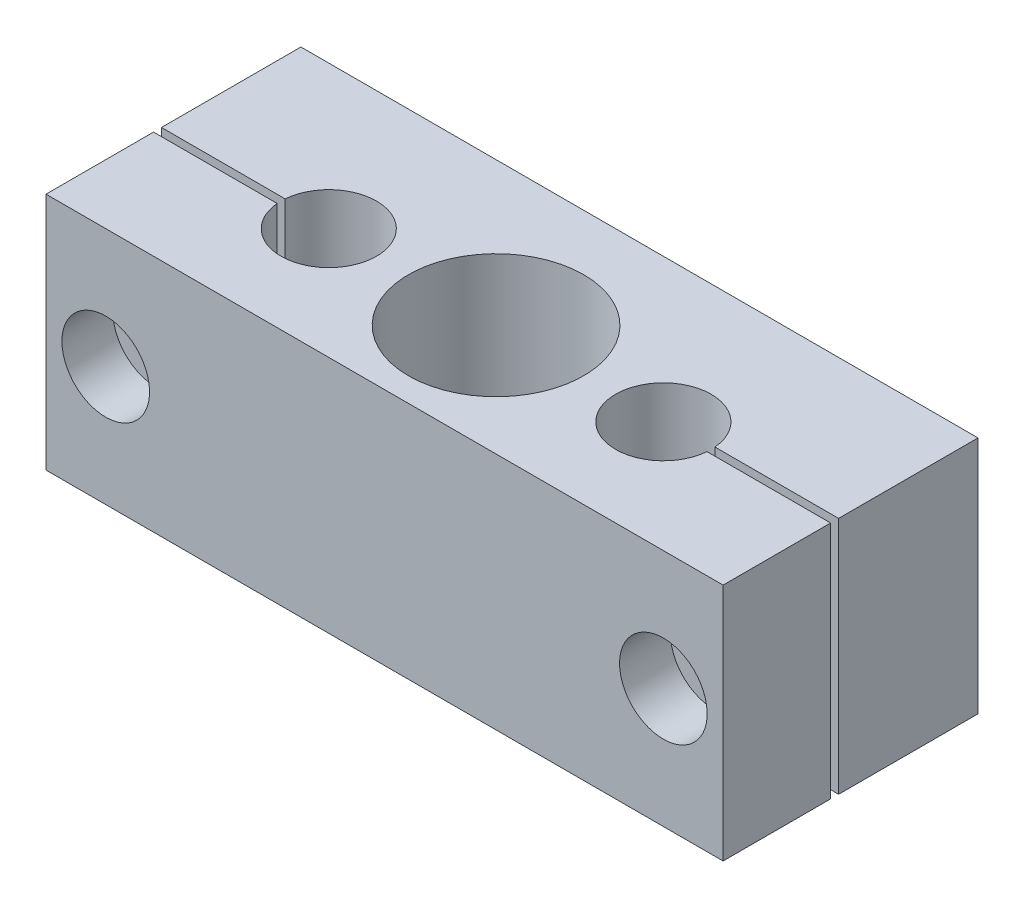
ISO-10303-21;
HEADER;
FILE_DESCRIPTION(('STEP AP214'),'2;1');
FILE_NAME('part.step','',(''),(''),'','','');
FILE_SCHEMA(('AUTOMOTIVE_DESIGN { 1 0 10303 214 1 1 1 1 }'));
ENDSEC;
DATA;
#1=APPLICATION_CONTEXT('core data for automotive mechanical design processes');
#2=APPLICATION_PROTOCOL_DEFINITION('international standard','automotive_design',2000,#1);
#3=PRODUCT_CONTEXT('',#1,'mechanical');
#4=PRODUCT('Part','Part','',(#3));
#5=PRODUCT_RELATED_PRODUCT_CATEGORY('part','',(#4));
#6=PRODUCT_DEFINITION_FORMATION('','',#4);
#7=PRODUCT_DEFINITION_CONTEXT('part definition',#1,'design');
#8=PRODUCT_DEFINITION('design','',#6,#7);
#9=PRODUCT_DEFINITION_SHAPE('','',#8);
#10=(LENGTH_UNIT() NAMED_UNIT(*) SI_UNIT(.MILLI.,.METRE.));
#11=(NAMED_UNIT(*) PLANE_ANGLE_UNIT() SI_UNIT($,.RADIAN.));
#12=(NAMED_UNIT(*) SI_UNIT($,.STERADIAN.) SOLID_ANGLE_UNIT());
#13=UNCERTAINTY_MEASURE_WITH_UNIT(LENGTH_MEASURE(1.E-05),#10,'distance_accuracy_value','');
#14=(GEOMETRIC_REPRESENTATION_CONTEXT(3) GLOBAL_UNCERTAINTY_ASSIGNED_CONTEXT((#13)) GLOBAL_UNIT_ASSIGNED_CONTEXT((#10,
#11,#12)) REPRESENTATION_CONTEXT('',''));
#15=CARTESIAN_POINT('',(0.,0.,0.));
#16=DIRECTION('',(0.,0.,1.));
#17=DIRECTION('',(1.,0.,0.));
#18=AXIS2_PLACEMENT_3D('',#15,#16,#17);
#19=CARTESIAN_POINT('',(-30.6,15.,25.6));
#20=DIRECTION('',(0.,0.,-1.));
#21=DIRECTION('',(-1.,0.,0.));
#22=AXIS2_PLACEMENT_3D('',#19,#20,#21);
#23=PLANE('',#22);
#24=CARTESIAN_POINT('',(-35.,15.,25.6));
#25=DIRECTION('',(0.,0.,-1.));
#26=DIRECTION('',(-1.,0.,0.));
#27=AXIS2_PLACEMENT_3D('',#24,#25,#26);
#28=CIRCLE('',#27,3.3);
#29=CARTESIAN_POINT('',(-38.3,15.,25.6));
#30=VERTEX_POINT('',#29);
#31=EDGE_CURVE('E23',#30,#30,#28,.T.);
#32=ORIENTED_EDGE('',*,*,#31,.T.);
#33=EDGE_LOOP('',(#32));
#34=FACE_BOUND('',#33,.T.);
#35=CARTESIAN_POINT('',(-35.,15.,25.6));
#36=DIRECTION('',(0.,0.,-1.));
#37=DIRECTION('',(-1.,0.,0.));
#38=AXIS2_PLACEMENT_3D('',#35,#36,#37);
#39=CIRCLE('',#38,5.5);
#40=CARTESIAN_POINT('',(-40.5,15.,25.6));
#41=VERTEX_POINT('',#40);
#42=EDGE_CURVE('E379',#41,#41,#39,.F.);
#43=ORIENTED_EDGE('',*,*,#42,.T.);
#44=EDGE_LOOP('',(#43));
#45=FACE_BOUND('',#44,.T.);
#46=ADVANCED_FACE('F19',(#34,#45),#23,.F.);
#47=CARTESIAN_POINT('',(39.4,15.,25.6));
#48=DIRECTION('',(0.,0.,-1.));
#49=DIRECTION('',(-1.,0.,0.));
#50=AXIS2_PLACEMENT_3D('',#47,#48,#49);
#51=PLANE('',#50);
#52=CARTESIAN_POINT('',(35.,15.,25.6));
#53=DIRECTION('',(0.,0.,-1.));
#54=DIRECTION('',(-1.,0.,0.));
#55=AXIS2_PLACEMENT_3D('',#52,#53,#54);
#56=CIRCLE('',#55,3.3);
#57=CARTESIAN_POINT('',(31.7,15.,25.6));
#58=VERTEX_POINT('',#57);
#59=EDGE_CURVE('E358',#58,#58,#56,.T.);
#60=ORIENTED_EDGE('',*,*,#59,.T.);
#61=EDGE_LOOP('',(#60));
#62=FACE_BOUND('',#61,.T.);
#63=CARTESIAN_POINT('',(35.,15.,25.6));
#64=DIRECTION('',(0.,0.,-1.));
#65=DIRECTION('',(-1.,0.,0.));
#66=AXIS2_PLACEMENT_3D('',#63,#64,#65);
#67=CIRCLE('',#66,5.5);
#68=CARTESIAN_POINT('',(29.5,15.,25.6));
#69=VERTEX_POINT('',#68);
#70=EDGE_CURVE('E879',#69,#69,#67,.F.);
#71=ORIENTED_EDGE('',*,*,#70,.T.);
#72=EDGE_LOOP('',(#71));
#73=FACE_BOUND('',#72,.T.);
#74=ADVANCED_FACE('F636',(#62,#73),#51,.F.);
#75=CARTESIAN_POINT('',(-35.,15.,17.5000000000409));
#76=DIRECTION('',(0.,0.,1.));
#77=DIRECTION('',(1.,0.,0.));
#78=AXIS2_PLACEMENT_3D('',#75,#76,#77);
#79=CONICAL_SURFACE('',#78,4.00000000004411,0.785398163397448);
#80=CARTESIAN_POINT('',(-35.,15.,16.9));
#81=DIRECTION('',(0.,0.,1.));
#82=DIRECTION('',(1.,0.,0.));
#83=AXIS2_PLACEMENT_3D('',#80,#81,#82);
#84=CIRCLE('',#83,3.4);
#85=CARTESIAN_POINT('',(-31.6,15.,16.9));
#86=VERTEX_POINT('',#85);
#87=EDGE_CURVE('E357',#86,#86,#84,.F.);
#88=ORIENTED_EDGE('',*,*,#87,.T.);
#89=EDGE_LOOP('',(#88));
#90=FACE_BOUND('',#89,.T.);
#91=CARTESIAN_POINT('',(-35.,15.,17.5000000000409));
#92=DIRECTION('',(0.,0.,1.));
#93=DIRECTION('',(1.,0.,0.));
#94=AXIS2_PLACEMENT_3D('',#91,#92,#93);
#95=CIRCLE('',#94,4.00000000004411);
#96=CARTESIAN_POINT('',(-30.9999999999559,15.,17.5000000000409));
#97=VERTEX_POINT('',#96);
#98=EDGE_CURVE('E361',#97,#97,#95,.F.);
#99=ORIENTED_EDGE('',*,*,#98,.F.);
#100=EDGE_LOOP('',(#99));
#101=FACE_BOUND('',#100,.T.);
#102=ADVANCED_FACE('F627',(#90,#101),#79,.F.);
#103=CARTESIAN_POINT('',(-35.,15.,21.55));
#104=DIRECTION('',(0.,0.,-1.));
#105=DIRECTION('',(-1.,0.,0.));
#106=AXIS2_PLACEMENT_3D('',#103,#104,#105);
#107=CYLINDRICAL_SURFACE('',#106,3.3);
#108=ORIENTED_EDGE('',*,*,#31,.F.);
#109=EDGE_LOOP('',(#108));
#110=FACE_BOUND('',#109,.T.);
#111=CARTESIAN_POINT('',(-35.,15.,18.5));
#112=DIRECTION('',(0.,0.,-1.));
#113=DIRECTION('',(-1.,0.,0.));
#114=AXIS2_PLACEMENT_3D('',#111,#112,#113);
#115=CIRCLE('',#114,3.3);
#116=CARTESIAN_POINT('',(-38.3,15.,18.5));
#117=VERTEX_POINT('',#116);
#118=EDGE_CURVE('E160',#117,#117,#115,.T.);
#119=ORIENTED_EDGE('',*,*,#118,.T.);
#120=EDGE_LOOP('',(#119));
#121=FACE_BOUND('',#120,.T.);
#122=ADVANCED_FACE('F619',(#110,#121),#107,.F.);
#123=CARTESIAN_POINT('',(35.,15.,28.8));
#124=DIRECTION('',(0.,0.,-1.));
#125=DIRECTION('',(-1.,0.,0.));
#126=AXIS2_PLACEMENT_3D('',#123,#124,#125);
#127=CYLINDRICAL_SURFACE('',#126,5.5);
#128=CARTESIAN_POINT('',(35.,15.,32.));
#129=DIRECTION('',(0.,0.,-1.));
#130=DIRECTION('',(-1.,0.,0.));
#131=AXIS2_PLACEMENT_3D('',#128,#129,#130);
#132=CIRCLE('',#131,5.5);
#133=CARTESIAN_POINT('',(29.5,15.,32.));
#134=VERTEX_POINT('',#133);
#135=EDGE_CURVE('E437',#134,#134,#132,.T.);
#136=ORIENTED_EDGE('',*,*,#135,.F.);
#137=EDGE_LOOP('',(#136));
#138=FACE_BOUND('',#137,.T.);
#139=ORIENTED_EDGE('',*,*,#70,.F.);
#140=EDGE_LOOP('',(#139));
#141=FACE_BOUND('',#140,.T.);
#142=ADVANCED_FACE('F555',(#138,#141),#127,.F.);
#143=CARTESIAN_POINT('',(-35.,15.,28.8));
#144=DIRECTION('',(0.,0.,-1.));
#145=DIRECTION('',(-1.,0.,0.));
#146=AXIS2_PLACEMENT_3D('',#143,#144,#145);
#147=CYLINDRICAL_SURFACE('',#146,5.5);
#148=CARTESIAN_POINT('',(-35.,15.,32.));
#149=DIRECTION('',(0.,0.,-1.));
#150=DIRECTION('',(-1.,0.,0.));
#151=AXIS2_PLACEMENT_3D('',#148,#149,#150);
#152=CIRCLE('',#151,5.5);
#153=CARTESIAN_POINT('',(-40.5,15.,32.));
#154=VERTEX_POINT('',#153);
#155=EDGE_CURVE('E199',#154,#154,#152,.T.);
#156=ORIENTED_EDGE('',*,*,#155,.F.);
#157=EDGE_LOOP('',(#156));
#158=FACE_BOUND('',#157,.T.);
#159=ORIENTED_EDGE('',*,*,#42,.F.);
#160=EDGE_LOOP('',(#159));
#161=FACE_BOUND('',#160,.T.);
#162=ADVANCED_FACE('F547',(#158,#161),#147,.F.);
#163=CARTESIAN_POINT('',(35.,15.,21.55));
#164=DIRECTION('',(0.,0.,-1.));
#165=DIRECTION('',(-1.,0.,0.));
#166=AXIS2_PLACEMENT_3D('',#163,#164,#165);
#167=CYLINDRICAL_SURFACE('',#166,3.3);
#168=ORIENTED_EDGE('',*,*,#59,.F.);
#169=EDGE_LOOP('',(#168));
#170=FACE_BOUND('',#169,.T.);
#171=CARTESIAN_POINT('',(35.,15.,18.5));
#172=DIRECTION('',(0.,0.,-1.));
#173=DIRECTION('',(-1.,0.,0.));
#174=AXIS2_PLACEMENT_3D('',#171,#172,#173);
#175=CIRCLE('',#174,3.3);
#176=CARTESIAN_POINT('',(31.7,15.,18.5));
#177=VERTEX_POINT('',#176);
#178=EDGE_CURVE('E271',#177,#177,#175,.T.);
#179=ORIENTED_EDGE('',*,*,#178,.T.);
#180=EDGE_LOOP('',(#179));
#181=FACE_BOUND('',#180,.T.);
#182=ADVANCED_FACE('F522',(#170,#181),#167,.F.);
#183=CARTESIAN_POINT('',(35.,15.,17.4999999999272));
#184=DIRECTION('',(0.,0.,1.));
#185=DIRECTION('',(1.,0.,0.));
#186=AXIS2_PLACEMENT_3D('',#183,#184,#185);
#187=CONICAL_SURFACE('',#186,3.99999999999409,0.785398163444818);
#188=CARTESIAN_POINT('',(35.,15.,16.9));
#189=DIRECTION('',(0.,0.,1.));
#190=DIRECTION('',(1.,0.,0.));
#191=AXIS2_PLACEMENT_3D('',#188,#189,#190);
#192=CIRCLE('',#191,3.4);
#193=CARTESIAN_POINT('',(38.4,15.,16.9));
#194=VERTEX_POINT('',#193);
#195=EDGE_CURVE('E354',#194,#194,#192,.F.);
#196=ORIENTED_EDGE('',*,*,#195,.T.);
#197=EDGE_LOOP('',(#196));
#198=FACE_BOUND('',#197,.T.);
#199=CARTESIAN_POINT('',(35.,15.,17.4999999999522));
#200=DIRECTION('',(0.,0.,1.));
#201=DIRECTION('',(1.,0.,0.));
#202=AXIS2_PLACEMENT_3D('',#199,#200,#201);
#203=CIRCLE('',#202,4.0000000000191);
#204=CARTESIAN_POINT('',(39.0000000000191,15.,17.4999999999522));
#205=VERTEX_POINT('',#204);
#206=EDGE_CURVE('E266',#205,#205,#203,.F.);
#207=ORIENTED_EDGE('',*,*,#206,.F.);
#208=EDGE_LOOP('',(#207));
#209=FACE_BOUND('',#208,.T.);
#210=ADVANCED_FACE('F540',(#198,#209),#187,.F.);
#211=CARTESIAN_POINT('',(35.,15.,8.75));
#212=DIRECTION('',(0.,0.,1.));
#213=DIRECTION('',(1.,0.,0.));
#214=AXIS2_PLACEMENT_3D('',#211,#212,#213);
#215=CYLINDRICAL_SURFACE('',#214,3.4);
#216=CARTESIAN_POINT('',(35.,15.,0.600000000076761));
#217=DIRECTION('',(0.,0.,-1.));
#218=DIRECTION('',(-1.,0.,0.));
#219=AXIS2_PLACEMENT_3D('',#216,#217,#218);
#220=CIRCLE('',#219,3.39999999997417);
#221=CARTESIAN_POINT('',(31.6000000000258,15.,0.600000000076761));
#222=VERTEX_POINT('',#221);
#223=EDGE_CURVE('E232',#222,#222,#220,.T.);
#224=ORIENTED_EDGE('',*,*,#223,.T.);
#225=EDGE_LOOP('',(#224));
#226=FACE_BOUND('',#225,.T.);
#227=ORIENTED_EDGE('',*,*,#195,.F.);
#228=EDGE_LOOP('',(#227));
#229=FACE_BOUND('',#228,.T.);
#230=ADVANCED_FACE('F474',(#226,#229),#215,.F.);
#231=CARTESIAN_POINT('',(-35.,15.,8.75));
#232=DIRECTION('',(0.,0.,1.));
#233=DIRECTION('',(1.,0.,0.));
#234=AXIS2_PLACEMENT_3D('',#231,#232,#233);
#235=CYLINDRICAL_SURFACE('',#234,3.4);
#236=CARTESIAN_POINT('',(-35.,15.,0.599999999963075));
#237=DIRECTION('',(0.,0.,-1.));
#238=DIRECTION('',(-1.,0.,0.));
#239=AXIS2_PLACEMENT_3D('',#236,#237,#238);
#240=CIRCLE('',#239,3.40000000002419);
#241=CARTESIAN_POINT('',(-38.4000000000242,15.,0.599999999963075));
#242=VERTEX_POINT('',#241);
#243=EDGE_CURVE('E226',#242,#242,#240,.T.);
#244=ORIENTED_EDGE('',*,*,#243,.T.);
#245=EDGE_LOOP('',(#244));
#246=FACE_BOUND('',#245,.T.);
#247=ORIENTED_EDGE('',*,*,#87,.F.);
#248=EDGE_LOOP('',(#247));
#249=FACE_BOUND('',#248,.T.);
#250=ADVANCED_FACE('F530',(#246,#249),#235,.F.);
#251=CARTESIAN_POINT('',(0.,15.,18.));
#252=DIRECTION('',(0.,-1.,0.));
#253=DIRECTION('',(0.,0.,-1.));
#254=AXIS2_PLACEMENT_3D('',#251,#252,#253);
#255=CYLINDRICAL_SURFACE('',#254,11.);
#256=CARTESIAN_POINT('',(0.,30.,18.));
#257=DIRECTION('',(0.,-1.,0.));
#258=DIRECTION('',(0.,0.,-1.));
#259=AXIS2_PLACEMENT_3D('',#256,#257,#258);
#260=CIRCLE('',#259,11.);
#261=CARTESIAN_POINT('',(0.,30.,7.));
#262=VERTEX_POINT('',#261);
#263=EDGE_CURVE('E231',#262,#262,#260,.F.);
#264=ORIENTED_EDGE('',*,*,#263,.T.);
#265=EDGE_LOOP('',(#264));
#266=FACE_BOUND('',#265,.T.);
#267=CARTESIAN_POINT('',(0.,0.,18.));
#268=DIRECTION('',(0.,-1.,0.));
#269=DIRECTION('',(0.,0.,-1.));
#270=AXIS2_PLACEMENT_3D('',#267,#268,#269);
#271=CIRCLE('',#270,11.);
#272=CARTESIAN_POINT('',(0.,0.,7.));
#273=VERTEX_POINT('',#272);
#274=EDGE_CURVE('E249',#273,#273,#271,.T.);
#275=ORIENTED_EDGE('',*,*,#274,.T.);
#276=EDGE_LOOP('',(#275));
#277=FACE_BOUND('',#276,.T.);
#278=ADVANCED_FACE('F526',(#266,#277),#255,.F.);
#279=CARTESIAN_POINT('',(21.,15.,18.));
#280=DIRECTION('',(0.,-1.,0.));
#281=DIRECTION('',(0.,0.,-1.));
#282=AXIS2_PLACEMENT_3D('',#279,#280,#281);
#283=CYLINDRICAL_SURFACE('',#282,6.);
#284=CARTESIAN_POINT('',(21.,0.,18.));
#285=DIRECTION('',(0.,-1.,0.));
#286=DIRECTION('',(0.,0.,-1.));
#287=AXIS2_PLACEMENT_3D('',#284,#285,#286);
#288=CIRCLE('',#287,6.);
#289=CARTESIAN_POINT('',(26.9791303715507,0.,18.5));
#290=VERTEX_POINT('',#289);
#291=CARTESIAN_POINT('',(26.9791303715507,0.,17.5));
#292=VERTEX_POINT('',#291);
#293=EDGE_CURVE('E243',#290,#292,#288,.T.);
#294=ORIENTED_EDGE('',*,*,#293,.T.);
#295=DIRECTION('',(0.,1.,0.));
#296=VECTOR('',#295,1.);
#297=CARTESIAN_POINT('',(26.9791303715507,15.,17.5));
#298=LINE('',#297,#296);
#299=CARTESIAN_POINT('',(26.9791303715507,30.,17.5));
#300=VERTEX_POINT('',#299);
#301=EDGE_CURVE('E270',#300,#292,#298,.F.);
#302=ORIENTED_EDGE('',*,*,#301,.F.);
#303=CARTESIAN_POINT('',(21.,30.,18.));
#304=DIRECTION('',(0.,-1.,0.));
#305=DIRECTION('',(0.,0.,-1.));
#306=AXIS2_PLACEMENT_3D('',#303,#304,#305);
#307=CIRCLE('',#306,6.);
#308=CARTESIAN_POINT('',(26.9791303715507,30.,18.5));
#309=VERTEX_POINT('',#308);
#310=EDGE_CURVE('E257',#300,#309,#307,.F.);
#311=ORIENTED_EDGE('',*,*,#310,.T.);
#312=DIRECTION('',(0.,1.,0.));
#313=VECTOR('',#312,1.);
#314=CARTESIAN_POINT('',(26.9791303715507,15.,18.5));
#315=LINE('',#314,#313);
#316=EDGE_CURVE('E178',#309,#290,#315,.F.);
#317=ORIENTED_EDGE('',*,*,#316,.T.);
#318=EDGE_LOOP('',(#294,#302,#311,#317));
#319=FACE_BOUND('',#318,.T.);
#320=ADVANCED_FACE('F307',(#319),#283,.F.);
#321=CARTESIAN_POINT('',(-31.875,15.,17.5));
#322=DIRECTION('',(0.,0.,1.));
#323=DIRECTION('',(1.,0.,0.));
#324=AXIS2_PLACEMENT_3D('',#321,#322,#323);
#325=PLANE('',#324);
#326=DIRECTION('',(0.,1.,0.));
#327=VECTOR('',#326,1.);
#328=CARTESIAN_POINT('',(-42.5,15.,17.5));
#329=LINE('',#328,#327);
#330=CARTESIAN_POINT('',(-42.5,30.,17.5));
#331=VERTEX_POINT('',#330);
#332=CARTESIAN_POINT('',(-42.5,0.,17.5));
#333=VERTEX_POINT('',#332);
#334=EDGE_CURVE('E256',#331,#333,#329,.F.);
#335=ORIENTED_EDGE('',*,*,#334,.T.);
#336=DIRECTION('',(1.,0.,0.));
#337=VECTOR('',#336,1.);
#338=CARTESIAN_POINT('',(0.,0.,17.5));
#339=LINE('',#338,#337);
#340=CARTESIAN_POINT('',(-26.9791303715507,0.,17.5));
#341=VERTEX_POINT('',#340);
#342=EDGE_CURVE('E330',#333,#341,#339,.T.);
#343=ORIENTED_EDGE('',*,*,#342,.T.);
#344=DIRECTION('',(0.,-1.,0.));
#345=VECTOR('',#344,1.);
#346=CARTESIAN_POINT('',(-26.9791303715507,15.,17.5));
#347=LINE('',#346,#345);
#348=CARTESIAN_POINT('',(-26.9791303715507,30.,17.5));
#349=VERTEX_POINT('',#348);
#350=EDGE_CURVE('E132',#341,#349,#347,.F.);
#351=ORIENTED_EDGE('',*,*,#350,.T.);
#352=DIRECTION('',(1.,0.,0.));
#353=VECTOR('',#352,1.);
#354=CARTESIAN_POINT('',(0.,30.,17.5));
#355=LINE('',#354,#353);
#356=EDGE_CURVE('E147',#349,#331,#355,.F.);
#357=ORIENTED_EDGE('',*,*,#356,.T.);
#358=EDGE_LOOP('',(#335,#343,#351,#357));
#359=FACE_BOUND('',#358,.T.);
#360=ORIENTED_EDGE('',*,*,#98,.T.);
#361=EDGE_LOOP('',(#360));
#362=FACE_BOUND('',#361,.T.);
#363=ADVANCED_FACE('F400',(#359,#362),#325,.T.);
#364=CARTESIAN_POINT('',(-21.,15.,18.));
#365=DIRECTION('',(0.,-1.,0.));
#366=DIRECTION('',(0.,0.,-1.));
#367=AXIS2_PLACEMENT_3D('',#364,#365,#366);
#368=CYLINDRICAL_SURFACE('',#367,6.);
#369=CARTESIAN_POINT('',(-21.,0.,18.));
#370=DIRECTION('',(0.,-1.,0.));
#371=DIRECTION('',(0.,0.,-1.));
#372=AXIS2_PLACEMENT_3D('',#369,#370,#371);
#373=CIRCLE('',#372,6.);
#374=CARTESIAN_POINT('',(-26.9791303715507,0.,18.5));
#375=VERTEX_POINT('',#374);
#376=EDGE_CURVE('E154',#341,#375,#373,.T.);
#377=ORIENTED_EDGE('',*,*,#376,.T.);
#378=DIRECTION('',(0.,1.,0.));
#379=VECTOR('',#378,1.);
#380=CARTESIAN_POINT('',(-26.9791303715507,15.,18.5));
#381=LINE('',#380,#379);
#382=CARTESIAN_POINT('',(-26.9791303715507,30.,18.5));
#383=VERTEX_POINT('',#382);
#384=EDGE_CURVE('E152',#375,#383,#381,.T.);
#385=ORIENTED_EDGE('',*,*,#384,.T.);
#386=CARTESIAN_POINT('',(-21.,30.,18.));
#387=DIRECTION('',(0.,-1.,0.));
#388=DIRECTION('',(0.,0.,-1.));
#389=AXIS2_PLACEMENT_3D('',#386,#387,#388);
#390=CIRCLE('',#389,6.);
#391=EDGE_CURVE('E138',#383,#349,#390,.F.);
#392=ORIENTED_EDGE('',*,*,#391,.T.);
#393=ORIENTED_EDGE('',*,*,#350,.F.);
#394=EDGE_LOOP('',(#377,#385,#392,#393));
#395=FACE_BOUND('',#394,.T.);
#396=ADVANCED_FACE('F153',(#395),#368,.F.);
#397=CARTESIAN_POINT('',(-31.875,15.,18.5));
#398=DIRECTION('',(0.,0.,1.));
#399=DIRECTION('',(1.,0.,0.));
#400=AXIS2_PLACEMENT_3D('',#397,#398,#399);
#401=PLANE('',#400);
#402=DIRECTION('',(1.,0.,0.));
#403=VECTOR('',#402,1.);
#404=CARTESIAN_POINT('',(0.,0.,18.5));
#405=LINE('',#404,#403);
#406=CARTESIAN_POINT('',(-42.5,0.,18.5));
#407=VERTEX_POINT('',#406);
#408=EDGE_CURVE('E206',#375,#407,#405,.F.);
#409=ORIENTED_EDGE('',*,*,#408,.T.);
#410=DIRECTION('',(0.,1.,0.));
#411=VECTOR('',#410,1.);
#412=CARTESIAN_POINT('',(-42.5,15.,18.5));
#413=LINE('',#412,#411);
#414=CARTESIAN_POINT('',(-42.5,30.,18.5));
#415=VERTEX_POINT('',#414);
#416=EDGE_CURVE('E159',#407,#415,#413,.T.);
#417=ORIENTED_EDGE('',*,*,#416,.T.);
#418=DIRECTION('',(1.,0.,0.));
#419=VECTOR('',#418,1.);
#420=CARTESIAN_POINT('',(0.,30.,18.5));
#421=LINE('',#420,#419);
#422=EDGE_CURVE('E144',#415,#383,#421,.T.);
#423=ORIENTED_EDGE('',*,*,#422,.T.);
#424=ORIENTED_EDGE('',*,*,#384,.F.);
#425=EDGE_LOOP('',(#409,#417,#423,#424));
#426=FACE_BOUND('',#425,.T.);
#427=ORIENTED_EDGE('',*,*,#118,.F.);
#428=EDGE_LOOP('',(#427));
#429=FACE_BOUND('',#428,.T.);
#430=ADVANCED_FACE('F162',(#426,#429),#401,.F.);
#431=CARTESIAN_POINT('',(-42.5,15.,16.));
#432=DIRECTION('',(1.,0.,0.));
#433=DIRECTION('',(0.,0.,-1.));
#434=AXIS2_PLACEMENT_3D('',#431,#432,#433);
#435=PLANE('',#434);
#436=DIRECTION('',(0.,0.,1.));
#437=VECTOR('',#436,1.);
#438=CARTESIAN_POINT('',(-42.5,0.,16.));
#439=LINE('',#438,#437);
#440=CARTESIAN_POINT('',(-42.5,0.,32.));
#441=VERTEX_POINT('',#440);
#442=EDGE_CURVE('E202',#407,#441,#439,.T.);
#443=ORIENTED_EDGE('',*,*,#442,.T.);
#444=DIRECTION('',(0.,1.,0.));
#445=VECTOR('',#444,1.);
#446=CARTESIAN_POINT('',(-42.5,15.,32.));
#447=LINE('',#446,#445);
#448=CARTESIAN_POINT('',(-42.5,30.,32.));
#449=VERTEX_POINT('',#448);
#450=EDGE_CURVE('E194',#449,#441,#447,.F.);
#451=ORIENTED_EDGE('',*,*,#450,.F.);
#452=DIRECTION('',(0.,0.,-1.));
#453=VECTOR('',#452,1.);
#454=CARTESIAN_POINT('',(-42.5,30.,16.));
#455=LINE('',#454,#453);
#456=EDGE_CURVE('E165',#449,#415,#455,.T.);
#457=ORIENTED_EDGE('',*,*,#456,.T.);
#458=ORIENTED_EDGE('',*,*,#416,.F.);
#459=EDGE_LOOP('',(#443,#451,#457,#458));
#460=FACE_BOUND('',#459,.T.);
#461=ADVANCED_FACE('F571',(#460),#435,.F.);
#462=CARTESIAN_POINT('',(0.,15.,32.));
#463=DIRECTION('',(0.,0.,1.));
#464=DIRECTION('',(1.,0.,0.));
#465=AXIS2_PLACEMENT_3D('',#462,#463,#464);
#466=PLANE('',#465);
#467=ORIENTED_EDGE('',*,*,#450,.T.);
#468=DIRECTION('',(1.,0.,0.));
#469=VECTOR('',#468,1.);
#470=CARTESIAN_POINT('',(0.,0.,32.));
#471=LINE('',#470,#469);
#472=CARTESIAN_POINT('',(42.5,0.,32.));
#473=VERTEX_POINT('',#472);
#474=EDGE_CURVE('E192',#441,#473,#471,.T.);
#475=ORIENTED_EDGE('',*,*,#474,.T.);
#476=DIRECTION('',(0.,1.,0.));
#477=VECTOR('',#476,1.);
#478=CARTESIAN_POINT('',(42.5,15.,32.));
#479=LINE('',#478,#477);
#480=CARTESIAN_POINT('',(42.5,30.,32.));
#481=VERTEX_POINT('',#480);
#482=EDGE_CURVE('E198',#473,#481,#479,.T.);
#483=ORIENTED_EDGE('',*,*,#482,.T.);
#484=DIRECTION('',(1.,0.,0.));
#485=VECTOR('',#484,1.);
#486=CARTESIAN_POINT('',(0.,30.,32.));
#487=LINE('',#486,#485);
#488=EDGE_CURVE('E170',#481,#449,#487,.F.);
#489=ORIENTED_EDGE('',*,*,#488,.T.);
#490=EDGE_LOOP('',(#467,#475,#483,#489));
#491=FACE_BOUND('',#490,.T.);
#492=ORIENTED_EDGE('',*,*,#155,.T.);
#493=EDGE_LOOP('',(#492));
#494=FACE_BOUND('',#493,.T.);
#495=ORIENTED_EDGE('',*,*,#135,.T.);
#496=EDGE_LOOP('',(#495));
#497=FACE_BOUND('',#496,.T.);
#498=ADVANCED_FACE('F428',(#491,#494,#497),#466,.T.);
#499=CARTESIAN_POINT('',(42.5,15.,16.));
#500=DIRECTION('',(-1.,0.,0.));
#501=DIRECTION('',(0.,0.,1.));
#502=AXIS2_PLACEMENT_3D('',#499,#500,#501);
#503=PLANE('',#502);
#504=DIRECTION('',(0.,0.,-1.));
#505=VECTOR('',#504,1.);
#506=CARTESIAN_POINT('',(42.5,30.,16.));
#507=LINE('',#506,#505);
#508=CARTESIAN_POINT('',(42.5,30.,18.5));
#509=VERTEX_POINT('',#508);
#510=EDGE_CURVE('E223',#509,#481,#507,.F.);
#511=ORIENTED_EDGE('',*,*,#510,.T.);
#512=ORIENTED_EDGE('',*,*,#482,.F.);
#513=DIRECTION('',(0.,0.,1.));
#514=VECTOR('',#513,1.);
#515=CARTESIAN_POINT('',(42.5,0.,16.));
#516=LINE('',#515,#514);
#517=CARTESIAN_POINT('',(42.5,0.,18.5));
#518=VERTEX_POINT('',#517);
#519=EDGE_CURVE('E290',#473,#518,#516,.F.);
#520=ORIENTED_EDGE('',*,*,#519,.T.);
#521=DIRECTION('',(0.,1.,0.));
#522=VECTOR('',#521,1.);
#523=CARTESIAN_POINT('',(42.5,15.,18.5));
#524=LINE('',#523,#522);
#525=EDGE_CURVE('E276',#518,#509,#524,.T.);
#526=ORIENTED_EDGE('',*,*,#525,.T.);
#527=EDGE_LOOP('',(#511,#512,#520,#526));
#528=FACE_BOUND('',#527,.T.);
#529=ADVANCED_FACE('F425',(#528),#503,.F.);
#530=CARTESIAN_POINT('',(31.875,15.,18.5));
#531=DIRECTION('',(0.,0.,1.));
#532=DIRECTION('',(1.,0.,0.));
#533=AXIS2_PLACEMENT_3D('',#530,#531,#532);
#534=PLANE('',#533);
#535=DIRECTION('',(1.,0.,0.));
#536=VECTOR('',#535,1.);
#537=CARTESIAN_POINT('',(0.,30.,18.5));
#538=LINE('',#537,#536);
#539=EDGE_CURVE('E260',#309,#509,#538,.T.);
#540=ORIENTED_EDGE('',*,*,#539,.T.);
#541=ORIENTED_EDGE('',*,*,#525,.F.);
#542=DIRECTION('',(1.,0.,0.));
#543=VECTOR('',#542,1.);
#544=CARTESIAN_POINT('',(0.,0.,18.5));
#545=LINE('',#544,#543);
#546=EDGE_CURVE('E293',#518,#290,#545,.F.);
#547=ORIENTED_EDGE('',*,*,#546,.T.);
#548=ORIENTED_EDGE('',*,*,#316,.F.);
#549=EDGE_LOOP('',(#540,#541,#547,#548));
#550=FACE_BOUND('',#549,.T.);
#551=ORIENTED_EDGE('',*,*,#178,.F.);
#552=EDGE_LOOP('',(#551));
#553=FACE_BOUND('',#552,.T.);
#554=ADVANCED_FACE('F312',(#550,#553),#534,.F.);
#555=CARTESIAN_POINT('',(31.875,15.,17.5));
#556=DIRECTION('',(0.,0.,1.));
#557=DIRECTION('',(1.,0.,0.));
#558=AXIS2_PLACEMENT_3D('',#555,#556,#557);
#559=PLANE('',#558);
#560=DIRECTION('',(0.,1.,0.));
#561=VECTOR('',#560,1.);
#562=CARTESIAN_POINT('',(42.5,15.,17.5));
#563=LINE('',#562,#561);
#564=CARTESIAN_POINT('',(42.5,0.,17.5));
#565=VERTEX_POINT('',#564);
#566=CARTESIAN_POINT('',(42.5,30.,17.5));
#567=VERTEX_POINT('',#566);
#568=EDGE_CURVE('E348',#565,#567,#563,.T.);
#569=ORIENTED_EDGE('',*,*,#568,.T.);
#570=DIRECTION('',(1.,0.,0.));
#571=VECTOR('',#570,1.);
#572=CARTESIAN_POINT('',(0.,30.,17.5));
#573=LINE('',#572,#571);
#574=EDGE_CURVE('E261',#567,#300,#573,.F.);
#575=ORIENTED_EDGE('',*,*,#574,.T.);
#576=ORIENTED_EDGE('',*,*,#301,.T.);
#577=DIRECTION('',(1.,0.,0.));
#578=VECTOR('',#577,1.);
#579=CARTESIAN_POINT('',(0.,0.,17.5));
#580=LINE('',#579,#578);
#581=EDGE_CURVE('E248',#292,#565,#580,.T.);
#582=ORIENTED_EDGE('',*,*,#581,.T.);
#583=EDGE_LOOP('',(#569,#575,#576,#582));
#584=FACE_BOUND('',#583,.T.);
#585=ORIENTED_EDGE('',*,*,#206,.T.);
#586=EDGE_LOOP('',(#585));
#587=FACE_BOUND('',#586,.T.);
#588=ADVANCED_FACE('F450',(#584,#587),#559,.T.);
#589=CARTESIAN_POINT('',(35.,15.,5.6843418860808E-11));
#590=DIRECTION('',(0.,0.,-1.));
#591=DIRECTION('',(-1.,0.,0.));
#592=AXIS2_PLACEMENT_3D('',#589,#590,#591);
#593=CONICAL_SURFACE('',#592,3.99999999999409,0.785398163397448);
#594=CARTESIAN_POINT('',(35.,15.,5.6843418860808E-11));
#595=DIRECTION('',(0.,0.,-1.));
#596=DIRECTION('',(-1.,0.,0.));
#597=AXIS2_PLACEMENT_3D('',#594,#595,#596);
#598=CIRCLE('',#597,3.99999999999409);
#599=CARTESIAN_POINT('',(31.0000000000059,15.,5.6843418860808E-11));
#600=VERTEX_POINT('',#599);
#601=EDGE_CURVE('E342',#600,#600,#598,.T.);
#602=ORIENTED_EDGE('',*,*,#601,.T.);
#603=EDGE_LOOP('',(#602));
#604=FACE_BOUND('',#603,.T.);
#605=ORIENTED_EDGE('',*,*,#223,.F.);
#606=EDGE_LOOP('',(#605));
#607=FACE_BOUND('',#606,.T.);
#608=ADVANCED_FACE('F477',(#604,#607),#593,.F.);
#609=CARTESIAN_POINT('',(-35.,15.,5.6843418860808E-11));
#610=DIRECTION('',(0.,0.,-1.));
#611=DIRECTION('',(-1.,0.,0.));
#612=AXIS2_PLACEMENT_3D('',#609,#610,#611);
#613=CONICAL_SURFACE('',#612,3.99999999998726,0.785398163444818);
#614=CARTESIAN_POINT('',(-35.,15.,8.18511924881205E-11));
#615=DIRECTION('',(0.,0.,-1.));
#616=DIRECTION('',(-1.,0.,0.));
#617=AXIS2_PLACEMENT_3D('',#614,#615,#616);
#618=CIRCLE('',#617,3.99999999996226);
#619=CARTESIAN_POINT('',(-38.9999999999623,15.,8.18511924881205E-11));
#620=VERTEX_POINT('',#619);
#621=EDGE_CURVE('E347',#620,#620,#618,.T.);
#622=ORIENTED_EDGE('',*,*,#621,.T.);
#623=EDGE_LOOP('',(#622));
#624=FACE_BOUND('',#623,.T.);
#625=ORIENTED_EDGE('',*,*,#243,.F.);
#626=EDGE_LOOP('',(#625));
#627=FACE_BOUND('',#626,.T.);
#628=ADVANCED_FACE('F479',(#624,#627),#613,.F.);
#629=CARTESIAN_POINT('',(0.,30.,16.));
#630=DIRECTION('',(0.,-1.,0.));
#631=DIRECTION('',(0.,0.,-1.));
#632=AXIS2_PLACEMENT_3D('',#629,#630,#631);
#633=PLANE('',#632);
#634=ORIENTED_EDGE('',*,*,#310,.F.);
#635=ORIENTED_EDGE('',*,*,#574,.F.);
#636=DIRECTION('',(0.,0.,1.));
#637=VECTOR('',#636,1.);
#638=CARTESIAN_POINT('',(42.5,30.,16.));
#639=LINE('',#638,#637);
#640=CARTESIAN_POINT('',(42.5,30.,0.));
#641=VERTEX_POINT('',#640);
#642=EDGE_CURVE('E317',#567,#641,#639,.F.);
#643=ORIENTED_EDGE('',*,*,#642,.T.);
#644=DIRECTION('',(1.,0.,0.));
#645=VECTOR('',#644,1.);
#646=CARTESIAN_POINT('',(0.,30.,0.));
#647=LINE('',#646,#645);
#648=CARTESIAN_POINT('',(-42.5,30.,0.));
#649=VERTEX_POINT('',#648);
#650=EDGE_CURVE('E353',#641,#649,#647,.F.);
#651=ORIENTED_EDGE('',*,*,#650,.T.);
#652=DIRECTION('',(0.,0.,-1.));
#653=VECTOR('',#652,1.);
#654=CARTESIAN_POINT('',(-42.5,30.,16.));
#655=LINE('',#654,#653);
#656=EDGE_CURVE('E389',#649,#331,#655,.F.);
#657=ORIENTED_EDGE('',*,*,#656,.T.);
#658=ORIENTED_EDGE('',*,*,#356,.F.);
#659=ORIENTED_EDGE('',*,*,#391,.F.);
#660=ORIENTED_EDGE('',*,*,#422,.F.);
#661=ORIENTED_EDGE('',*,*,#456,.F.);
#662=ORIENTED_EDGE('',*,*,#488,.F.);
#663=ORIENTED_EDGE('',*,*,#510,.F.);
#664=ORIENTED_EDGE('',*,*,#539,.F.);
#665=EDGE_LOOP('',(#634,#635,#643,#651,#657,#658,#659,#660,#661,#662,#663,#664));
#666=FACE_BOUND('',#665,.T.);
#667=ORIENTED_EDGE('',*,*,#263,.F.);
#668=EDGE_LOOP('',(#667));
#669=FACE_BOUND('',#668,.T.);
#670=ADVANCED_FACE('F140',(#666,#669),#633,.F.);
#671=CARTESIAN_POINT('',(-42.5,15.,16.));
#672=DIRECTION('',(1.,0.,0.));
#673=DIRECTION('',(0.,0.,-1.));
#674=AXIS2_PLACEMENT_3D('',#671,#672,#673);
#675=PLANE('',#674);
#676=ORIENTED_EDGE('',*,*,#656,.F.);
#677=DIRECTION('',(0.,1.,0.));
#678=VECTOR('',#677,1.);
#679=CARTESIAN_POINT('',(-42.5,15.,0.));
#680=LINE('',#679,#678);
#681=CARTESIAN_POINT('',(-42.5,0.,0.));
#682=VERTEX_POINT('',#681);
#683=EDGE_CURVE('E418',#649,#682,#680,.F.);
#684=ORIENTED_EDGE('',*,*,#683,.T.);
#685=DIRECTION('',(0.,0.,1.));
#686=VECTOR('',#685,1.);
#687=CARTESIAN_POINT('',(-42.5,0.,16.));
#688=LINE('',#687,#686);
#689=EDGE_CURVE('E333',#682,#333,#688,.T.);
#690=ORIENTED_EDGE('',*,*,#689,.T.);
#691=ORIENTED_EDGE('',*,*,#334,.F.);
#692=EDGE_LOOP('',(#676,#684,#690,#691));
#693=FACE_BOUND('',#692,.T.);
#694=ADVANCED_FACE('F404',(#693),#675,.F.);
#695=CARTESIAN_POINT('',(0.,0.,16.));
#696=DIRECTION('',(0.,1.,0.));
#697=DIRECTION('',(0.,0.,1.));
#698=AXIS2_PLACEMENT_3D('',#695,#696,#697);
#699=PLANE('',#698);
#700=ORIENTED_EDGE('',*,*,#519,.F.);
#701=ORIENTED_EDGE('',*,*,#474,.F.);
#702=ORIENTED_EDGE('',*,*,#442,.F.);
#703=ORIENTED_EDGE('',*,*,#408,.F.);
#704=ORIENTED_EDGE('',*,*,#376,.F.);
#705=ORIENTED_EDGE('',*,*,#342,.F.);
#706=ORIENTED_EDGE('',*,*,#689,.F.);
#707=DIRECTION('',(1.,0.,0.));
#708=VECTOR('',#707,1.);
#709=CARTESIAN_POINT('',(0.,0.,0.));
#710=LINE('',#709,#708);
#711=CARTESIAN_POINT('',(42.5,0.,0.));
#712=VERTEX_POINT('',#711);
#713=EDGE_CURVE('E31',#682,#712,#710,.T.);
#714=ORIENTED_EDGE('',*,*,#713,.T.);
#715=DIRECTION('',(0.,0.,1.));
#716=VECTOR('',#715,1.);
#717=CARTESIAN_POINT('',(42.5,0.,16.));
#718=LINE('',#717,#716);
#719=EDGE_CURVE('E41',#712,#565,#718,.T.);
#720=ORIENTED_EDGE('',*,*,#719,.T.);
#721=ORIENTED_EDGE('',*,*,#581,.F.);
#722=ORIENTED_EDGE('',*,*,#293,.F.);
#723=ORIENTED_EDGE('',*,*,#546,.F.);
#724=EDGE_LOOP('',(#700,#701,#702,#703,#704,#705,#706,#714,#720,#721,#722,#723));
#725=FACE_BOUND('',#724,.T.);
#726=ORIENTED_EDGE('',*,*,#274,.F.);
#727=EDGE_LOOP('',(#726));
#728=FACE_BOUND('',#727,.T.);
#729=ADVANCED_FACE('F456',(#725,#728),#699,.F.);
#730=CARTESIAN_POINT('',(42.5,15.,16.));
#731=DIRECTION('',(-1.,0.,0.));
#732=DIRECTION('',(0.,0.,1.));
#733=AXIS2_PLACEMENT_3D('',#730,#731,#732);
#734=PLANE('',#733);
#735=ORIENTED_EDGE('',*,*,#719,.F.);
#736=DIRECTION('',(0.,1.,0.));
#737=VECTOR('',#736,1.);
#738=CARTESIAN_POINT('',(42.5,15.,0.));
#739=LINE('',#738,#737);
#740=EDGE_CURVE('E12',#712,#641,#739,.T.);
#741=ORIENTED_EDGE('',*,*,#740,.T.);
#742=ORIENTED_EDGE('',*,*,#642,.F.);
#743=ORIENTED_EDGE('',*,*,#568,.F.);
#744=EDGE_LOOP('',(#735,#741,#742,#743));
#745=FACE_BOUND('',#744,.T.);
#746=ADVANCED_FACE('F453',(#745),#734,.F.);
#747=CARTESIAN_POINT('',(0.,15.,0.));
#748=DIRECTION('',(0.,0.,1.));
#749=DIRECTION('',(1.,0.,0.));
#750=AXIS2_PLACEMENT_3D('',#747,#748,#749);
#751=PLANE('',#750);
#752=ORIENTED_EDGE('',*,*,#713,.F.);
#753=ORIENTED_EDGE('',*,*,#683,.F.);
#754=ORIENTED_EDGE('',*,*,#650,.F.);
#755=ORIENTED_EDGE('',*,*,#740,.F.);
#756=EDGE_LOOP('',(#752,#753,#754,#755));
#757=FACE_BOUND('',#756,.T.);
#758=ORIENTED_EDGE('',*,*,#621,.F.);
#759=EDGE_LOOP('',(#758));
#760=FACE_BOUND('',#759,.T.);
#761=ORIENTED_EDGE('',*,*,#601,.F.);
#762=EDGE_LOOP('',(#761));
#763=FACE_BOUND('',#762,.T.);
#764=ADVANCED_FACE('F460',(#757,#760,#763),#751,.F.);
#765=CLOSED_SHELL('',(#46,#74,#102,#122,#142,#162,#182,#210,#230,#250,#278,#320,#363,#396,#430,
#461,#498,#529,#554,#588,#608,#628,#670,#694,#729,#746,#764));
#766=MANIFOLD_SOLID_BREP('B1',#765);
#767=ADVANCED_BREP_SHAPE_REPRESENTATION('',(#18,#766),#14);
#768=SHAPE_DEFINITION_REPRESENTATION(#9,#767);
ENDSEC;
END-ISO-10303-21;
